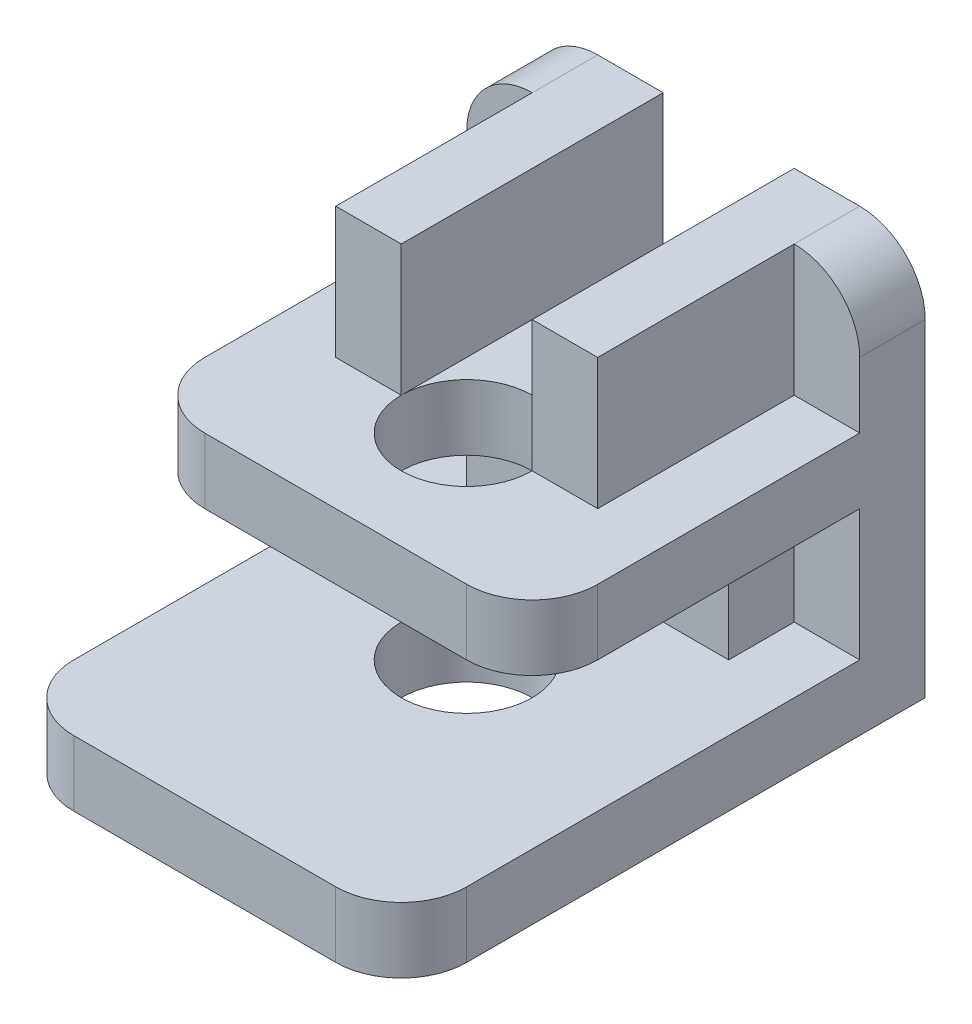
ISO-10303-21;
HEADER;
FILE_DESCRIPTION(('STEP AP214'),'2;1');
FILE_NAME('part.step','',(''),(''),'','','');
FILE_SCHEMA(('AUTOMOTIVE_DESIGN { 1 0 10303 214 1 1 1 1 }'));
ENDSEC;
DATA;
#1=APPLICATION_CONTEXT('core data for automotive mechanical design processes');
#2=APPLICATION_PROTOCOL_DEFINITION('international standard','automotive_design',2000,#1);
#3=PRODUCT_CONTEXT('',#1,'mechanical');
#4=PRODUCT('Part','Part','',(#3));
#5=PRODUCT_RELATED_PRODUCT_CATEGORY('part','',(#4));
#6=PRODUCT_DEFINITION_FORMATION('','',#4);
#7=PRODUCT_DEFINITION_CONTEXT('part definition',#1,'design');
#8=PRODUCT_DEFINITION('design','',#6,#7);
#9=PRODUCT_DEFINITION_SHAPE('','',#8);
#10=(LENGTH_UNIT() NAMED_UNIT(*) SI_UNIT(.MILLI.,.METRE.));
#11=(NAMED_UNIT(*) PLANE_ANGLE_UNIT() SI_UNIT($,.RADIAN.));
#12=(NAMED_UNIT(*) SI_UNIT($,.STERADIAN.) SOLID_ANGLE_UNIT());
#13=UNCERTAINTY_MEASURE_WITH_UNIT(LENGTH_MEASURE(1.E-05),#10,'distance_accuracy_value','');
#14=(GEOMETRIC_REPRESENTATION_CONTEXT(3) GLOBAL_UNCERTAINTY_ASSIGNED_CONTEXT((#13)) GLOBAL_UNIT_ASSIGNED_CONTEXT((#10,
#11,#12)) REPRESENTATION_CONTEXT('',''));
#15=CARTESIAN_POINT('',(0.,0.,0.));
#16=DIRECTION('',(0.,0.,1.));
#17=DIRECTION('',(1.,0.,0.));
#18=AXIS2_PLACEMENT_3D('',#15,#16,#17);
#19=CARTESIAN_POINT('',(0.,40.,-20.));
#20=DIRECTION('',(0.,-1.,0.));
#21=DIRECTION('',(0.,0.,-1.));
#22=AXIS2_PLACEMENT_3D('',#19,#20,#21);
#23=PLANE('',#22);
#24=CARTESIAN_POINT('',(30.,40.,-40.));
#25=DIRECTION('',(0.,-1.,0.));
#26=DIRECTION('',(0.,0.,-1.));
#27=AXIS2_PLACEMENT_3D('',#24,#25,#26);
#28=CIRCLE('',#27,10.);
#29=CARTESIAN_POINT('',(20.,40.,-40.));
#30=VERTEX_POINT('',#29);
#31=CARTESIAN_POINT('',(40.,40.,-40.));
#32=VERTEX_POINT('',#31);
#33=EDGE_CURVE('E217',#30,#32,#28,.F.);
#34=ORIENTED_EDGE('',*,*,#33,.F.);
#35=DIRECTION('',(1.,0.,0.));
#36=VECTOR('',#35,1.);
#37=CARTESIAN_POINT('',(10.,40.,-40.));
#38=LINE('',#37,#36);
#39=CARTESIAN_POINT('',(10.,40.,-40.));
#40=VERTEX_POINT('',#39);
#41=EDGE_CURVE('E228',#40,#30,#38,.T.);
#42=ORIENTED_EDGE('',*,*,#41,.F.);
#43=DIRECTION('',(0.,0.,-1.));
#44=VECTOR('',#43,1.);
#45=CARTESIAN_POINT('',(10.,40.,-40.));
#46=LINE('',#45,#44);
#47=CARTESIAN_POINT('',(10.,40.,-70.));
#48=VERTEX_POINT('',#47);
#49=EDGE_CURVE('E279',#40,#48,#46,.T.);
#50=ORIENTED_EDGE('',*,*,#49,.T.);
#51=DIRECTION('',(-1.,0.,0.));
#52=VECTOR('',#51,1.);
#53=CARTESIAN_POINT('',(0.,40.,-70.));
#54=LINE('',#53,#52);
#55=CARTESIAN_POINT('',(0.,40.,-70.));
#56=VERTEX_POINT('',#55);
#57=EDGE_CURVE('E315',#48,#56,#54,.T.);
#58=ORIENTED_EDGE('',*,*,#57,.T.);
#59=DIRECTION('',(0.,0.,-1.));
#60=VECTOR('',#59,1.);
#61=CARTESIAN_POINT('',(0.,40.,-20.));
#62=LINE('',#61,#60);
#63=CARTESIAN_POINT('',(0.,40.,-30.));
#64=VERTEX_POINT('',#63);
#65=EDGE_CURVE('E311',#64,#56,#62,.T.);
#66=ORIENTED_EDGE('',*,*,#65,.F.);
#67=CARTESIAN_POINT('',(10.,40.,-30.));
#68=DIRECTION('',(0.,-1.,0.));
#69=DIRECTION('',(0.,0.,-1.));
#70=AXIS2_PLACEMENT_3D('',#67,#68,#69);
#71=CIRCLE('',#70,10.);
#72=CARTESIAN_POINT('',(10.,40.,-20.));
#73=VERTEX_POINT('',#72);
#74=EDGE_CURVE('E48',#64,#73,#71,.F.);
#75=ORIENTED_EDGE('',*,*,#74,.T.);
#76=DIRECTION('',(-1.,0.,0.));
#77=VECTOR('',#76,1.);
#78=CARTESIAN_POINT('',(0.,40.,-20.));
#79=LINE('',#78,#77);
#80=CARTESIAN_POINT('',(50.,40.,-20.));
#81=VERTEX_POINT('',#80);
#82=EDGE_CURVE('E308',#81,#73,#79,.T.);
#83=ORIENTED_EDGE('',*,*,#82,.F.);
#84=CARTESIAN_POINT('',(50.,40.,-30.));
#85=DIRECTION('',(0.,-1.,0.));
#86=DIRECTION('',(0.,0.,-1.));
#87=AXIS2_PLACEMENT_3D('',#84,#85,#86);
#88=CIRCLE('',#87,10.);
#89=CARTESIAN_POINT('',(60.,40.,-30.));
#90=VERTEX_POINT('',#89);
#91=EDGE_CURVE('E56',#81,#90,#88,.F.);
#92=ORIENTED_EDGE('',*,*,#91,.T.);
#93=DIRECTION('',(0.,0.,-1.));
#94=VECTOR('',#93,1.);
#95=CARTESIAN_POINT('',(60.,40.,-20.));
#96=LINE('',#95,#94);
#97=CARTESIAN_POINT('',(60.,40.,-70.));
#98=VERTEX_POINT('',#97);
#99=EDGE_CURVE('E320',#90,#98,#96,.T.);
#100=ORIENTED_EDGE('',*,*,#99,.T.);
#101=CARTESIAN_POINT('',(50.,40.,-70.));
#102=VERTEX_POINT('',#101);
#103=EDGE_CURVE('E309',#98,#102,#54,.T.);
#104=ORIENTED_EDGE('',*,*,#103,.T.);
#105=DIRECTION('',(0.,0.,-1.));
#106=VECTOR('',#105,1.);
#107=CARTESIAN_POINT('',(50.,40.,-40.));
#108=LINE('',#107,#106);
#109=CARTESIAN_POINT('',(50.,40.,-40.));
#110=VERTEX_POINT('',#109);
#111=EDGE_CURVE('E277',#110,#102,#108,.T.);
#112=ORIENTED_EDGE('',*,*,#111,.F.);
#113=EDGE_CURVE('E230',#32,#110,#38,.T.);
#114=ORIENTED_EDGE('',*,*,#113,.F.);
#115=EDGE_LOOP('',(#34,#42,#50,#58,#66,#75,#83,#92,#100,#104,#112,#114));
#116=FACE_BOUND('',#115,.T.);
#117=ADVANCED_FACE('F33',(#116),#23,.F.);
#118=CARTESIAN_POINT('',(0.,60.,0.));
#119=DIRECTION('',(0.,1.,0.));
#120=DIRECTION('',(0.,0.,1.));
#121=AXIS2_PLACEMENT_3D('',#118,#119,#120);
#122=PLANE('',#121);
#123=DIRECTION('',(-1.,0.,0.));
#124=VECTOR('',#123,1.);
#125=CARTESIAN_POINT('',(0.,60.,-80.));
#126=LINE('',#125,#124);
#127=CARTESIAN_POINT('',(20.,60.,-80.));
#128=VERTEX_POINT('',#127);
#129=CARTESIAN_POINT('',(10.,60.,-80.));
#130=VERTEX_POINT('',#129);
#131=EDGE_CURVE('E330',#128,#130,#126,.T.);
#132=ORIENTED_EDGE('',*,*,#131,.T.);
#133=DIRECTION('',(0.,0.,1.));
#134=VECTOR('',#133,1.);
#135=CARTESIAN_POINT('',(10.,60.,-70.));
#136=LINE('',#135,#134);
#137=CARTESIAN_POINT('',(10.,60.,-70.));
#138=VERTEX_POINT('',#137);
#139=EDGE_CURVE('E390',#130,#138,#136,.T.);
#140=ORIENTED_EDGE('',*,*,#139,.T.);
#141=DIRECTION('',(0.,0.,-1.));
#142=VECTOR('',#141,1.);
#143=CARTESIAN_POINT('',(10.,60.,-40.));
#144=LINE('',#143,#142);
#145=CARTESIAN_POINT('',(10.,60.,-40.));
#146=VERTEX_POINT('',#145);
#147=EDGE_CURVE('E265',#146,#138,#144,.T.);
#148=ORIENTED_EDGE('',*,*,#147,.F.);
#149=DIRECTION('',(-1.,0.,0.));
#150=VECTOR('',#149,1.);
#151=CARTESIAN_POINT('',(10.,60.,-40.));
#152=LINE('',#151,#150);
#153=CARTESIAN_POINT('',(20.,60.,-40.));
#154=VERTEX_POINT('',#153);
#155=EDGE_CURVE('E257',#154,#146,#152,.T.);
#156=ORIENTED_EDGE('',*,*,#155,.F.);
#157=DIRECTION('',(0.,0.,1.));
#158=VECTOR('',#157,1.);
#159=CARTESIAN_POINT('',(20.,60.,-90.));
#160=LINE('',#159,#158);
#161=EDGE_CURVE('E240',#128,#154,#160,.T.);
#162=ORIENTED_EDGE('',*,*,#161,.F.);
#163=EDGE_LOOP('',(#132,#140,#148,#156,#162));
#164=FACE_BOUND('',#163,.T.);
#165=ADVANCED_FACE('F498',(#164),#122,.T.);
#166=CARTESIAN_POINT('',(0.,0.,-40.));
#167=DIRECTION('',(0.,0.,1.));
#168=DIRECTION('',(1.,0.,0.));
#169=AXIS2_PLACEMENT_3D('',#166,#167,#168);
#170=PLANE('',#169);
#171=DIRECTION('',(0.,-1.,0.));
#172=VECTOR('',#171,1.);
#173=CARTESIAN_POINT('',(20.,60.,-40.));
#174=LINE('',#173,#172);
#175=EDGE_CURVE('E235',#154,#30,#174,.T.);
#176=ORIENTED_EDGE('',*,*,#175,.F.);
#177=ORIENTED_EDGE('',*,*,#155,.T.);
#178=DIRECTION('',(0.,-1.,0.));
#179=VECTOR('',#178,1.);
#180=CARTESIAN_POINT('',(10.,60.,-40.));
#181=LINE('',#180,#179);
#182=EDGE_CURVE('E254',#146,#40,#181,.T.);
#183=ORIENTED_EDGE('',*,*,#182,.T.);
#184=ORIENTED_EDGE('',*,*,#41,.T.);
#185=EDGE_LOOP('',(#176,#177,#183,#184));
#186=FACE_BOUND('',#185,.T.);
#187=ADVANCED_FACE('F252',(#186),#170,.T.);
#188=CARTESIAN_POINT('',(0.,60.,-70.));
#189=DIRECTION('',(0.,0.,-1.));
#190=DIRECTION('',(-1.,0.,0.));
#191=AXIS2_PLACEMENT_3D('',#188,#189,#190);
#192=PLANE('',#191);
#193=DIRECTION('',(0.,-1.,0.));
#194=VECTOR('',#193,1.);
#195=CARTESIAN_POINT('',(10.,60.,-70.));
#196=LINE('',#195,#194);
#197=EDGE_CURVE('E266',#138,#48,#196,.T.);
#198=ORIENTED_EDGE('',*,*,#197,.F.);
#199=CARTESIAN_POINT('',(10.,50.,-70.));
#200=DIRECTION('',(0.,0.,-1.));
#201=DIRECTION('',(-1.,0.,0.));
#202=AXIS2_PLACEMENT_3D('',#199,#200,#201);
#203=CIRCLE('',#202,10.);
#204=CARTESIAN_POINT('',(0.,50.,-70.));
#205=VERTEX_POINT('',#204);
#206=EDGE_CURVE('E393',#138,#205,#203,.F.);
#207=ORIENTED_EDGE('',*,*,#206,.T.);
#208=DIRECTION('',(0.,-1.,0.));
#209=VECTOR('',#208,1.);
#210=CARTESIAN_POINT('',(0.,60.,-70.));
#211=LINE('',#210,#209);
#212=EDGE_CURVE('E338',#205,#56,#211,.T.);
#213=ORIENTED_EDGE('',*,*,#212,.T.);
#214=ORIENTED_EDGE('',*,*,#57,.F.);
#215=EDGE_LOOP('',(#198,#207,#213,#214));
#216=FACE_BOUND('',#215,.T.);
#217=ADVANCED_FACE('F507',(#216),#192,.F.);
#218=DIRECTION('',(0.,-1.,0.));
#219=VECTOR('',#218,1.);
#220=CARTESIAN_POINT('',(60.,60.,-70.));
#221=LINE('',#220,#219);
#222=CARTESIAN_POINT('',(60.,50.,-70.));
#223=VERTEX_POINT('',#222);
#224=EDGE_CURVE('E334',#223,#98,#221,.T.);
#225=ORIENTED_EDGE('',*,*,#224,.F.);
#226=CARTESIAN_POINT('',(50.,50.,-70.));
#227=DIRECTION('',(0.,0.,-1.));
#228=DIRECTION('',(-1.,0.,0.));
#229=AXIS2_PLACEMENT_3D('',#226,#227,#228);
#230=CIRCLE('',#229,10.);
#231=CARTESIAN_POINT('',(50.,60.,-70.));
#232=VERTEX_POINT('',#231);
#233=EDGE_CURVE('E402',#223,#232,#230,.F.);
#234=ORIENTED_EDGE('',*,*,#233,.T.);
#235=DIRECTION('',(0.,1.,0.));
#236=VECTOR('',#235,1.);
#237=CARTESIAN_POINT('',(50.,60.,-70.));
#238=LINE('',#237,#236);
#239=EDGE_CURVE('E268',#102,#232,#238,.T.);
#240=ORIENTED_EDGE('',*,*,#239,.F.);
#241=ORIENTED_EDGE('',*,*,#103,.F.);
#242=EDGE_LOOP('',(#225,#234,#240,#241));
#243=FACE_BOUND('',#242,.T.);
#244=ADVANCED_FACE('F471',(#243),#192,.F.);
#245=EDGE_CURVE('E213',#32,#30,#28,.F.);
#246=ORIENTED_EDGE('',*,*,#245,.F.);
#247=DIRECTION('',(0.,0.,1.));
#248=VECTOR('',#247,1.);
#249=CARTESIAN_POINT('',(40.,40.,-90.));
#250=LINE('',#249,#248);
#251=CARTESIAN_POINT('',(40.,40.,-80.));
#252=VERTEX_POINT('',#251);
#253=EDGE_CURVE('E249',#252,#32,#250,.T.);
#254=ORIENTED_EDGE('',*,*,#253,.F.);
#255=DIRECTION('',(1.,0.,0.));
#256=VECTOR('',#255,1.);
#257=CARTESIAN_POINT('',(0.,40.,-80.));
#258=LINE('',#257,#256);
#259=CARTESIAN_POINT('',(20.,40.,-80.));
#260=VERTEX_POINT('',#259);
#261=EDGE_CURVE('E248',#260,#252,#258,.T.);
#262=ORIENTED_EDGE('',*,*,#261,.F.);
#263=DIRECTION('',(0.,0.,1.));
#264=VECTOR('',#263,1.);
#265=CARTESIAN_POINT('',(20.,40.,-90.));
#266=LINE('',#265,#264);
#267=EDGE_CURVE('E237',#260,#30,#266,.T.);
#268=ORIENTED_EDGE('',*,*,#267,.T.);
#269=EDGE_LOOP('',(#246,#254,#262,#268));
#270=FACE_BOUND('',#269,.T.);
#271=ADVANCED_FACE('F246',(#270),#23,.F.);
#272=DIRECTION('',(0.,-1.,0.));
#273=VECTOR('',#272,1.);
#274=CARTESIAN_POINT('',(10.,30.,-70.));
#275=LINE('',#274,#273);
#276=CARTESIAN_POINT('',(10.,30.,-70.));
#277=VERTEX_POINT('',#276);
#278=CARTESIAN_POINT('',(10.,10.,-70.));
#279=VERTEX_POINT('',#278);
#280=EDGE_CURVE('E281',#277,#279,#275,.T.);
#281=ORIENTED_EDGE('',*,*,#280,.F.);
#282=DIRECTION('',(1.,0.,0.));
#283=VECTOR('',#282,1.);
#284=CARTESIAN_POINT('',(0.,30.,-70.));
#285=LINE('',#284,#283);
#286=CARTESIAN_POINT('',(0.,30.,-70.));
#287=VERTEX_POINT('',#286);
#288=EDGE_CURVE('E312',#287,#277,#285,.T.);
#289=ORIENTED_EDGE('',*,*,#288,.F.);
#290=CARTESIAN_POINT('',(0.,10.,-70.));
#291=VERTEX_POINT('',#290);
#292=EDGE_CURVE('E337',#287,#291,#211,.T.);
#293=ORIENTED_EDGE('',*,*,#292,.T.);
#294=DIRECTION('',(1.,0.,0.));
#295=VECTOR('',#294,1.);
#296=CARTESIAN_POINT('',(0.,10.,-70.));
#297=LINE('',#296,#295);
#298=EDGE_CURVE('E331',#291,#279,#297,.T.);
#299=ORIENTED_EDGE('',*,*,#298,.T.);
#300=EDGE_LOOP('',(#281,#289,#293,#299));
#301=FACE_BOUND('',#300,.T.);
#302=ADVANCED_FACE('F531',(#301),#192,.F.);
#303=DIRECTION('',(0.,1.,0.));
#304=VECTOR('',#303,1.);
#305=CARTESIAN_POINT('',(50.,30.,-70.));
#306=LINE('',#305,#304);
#307=CARTESIAN_POINT('',(50.,10.,-70.));
#308=VERTEX_POINT('',#307);
#309=CARTESIAN_POINT('',(50.,30.,-70.));
#310=VERTEX_POINT('',#309);
#311=EDGE_CURVE('E285',#308,#310,#306,.T.);
#312=ORIENTED_EDGE('',*,*,#311,.F.);
#313=CARTESIAN_POINT('',(60.,10.,-70.));
#314=VERTEX_POINT('',#313);
#315=EDGE_CURVE('E326',#308,#314,#297,.T.);
#316=ORIENTED_EDGE('',*,*,#315,.T.);
#317=CARTESIAN_POINT('',(60.,30.,-70.));
#318=VERTEX_POINT('',#317);
#319=EDGE_CURVE('E329',#318,#314,#221,.T.);
#320=ORIENTED_EDGE('',*,*,#319,.F.);
#321=EDGE_CURVE('E304',#310,#318,#285,.T.);
#322=ORIENTED_EDGE('',*,*,#321,.F.);
#323=EDGE_LOOP('',(#312,#316,#320,#322));
#324=FACE_BOUND('',#323,.T.);
#325=ADVANCED_FACE('F441',(#324),#192,.F.);
#326=CARTESIAN_POINT('',(0.,10.,0.));
#327=DIRECTION('',(0.,-1.,0.));
#328=DIRECTION('',(0.,0.,-1.));
#329=AXIS2_PLACEMENT_3D('',#326,#327,#328);
#330=PLANE('',#329);
#331=CARTESIAN_POINT('',(30.,10.,-40.));
#332=DIRECTION('',(0.,-1.,0.));
#333=DIRECTION('',(0.,0.,-1.));
#334=AXIS2_PLACEMENT_3D('',#331,#332,#333);
#335=CIRCLE('',#334,10.);
#336=CARTESIAN_POINT('',(30.,10.,-50.));
#337=VERTEX_POINT('',#336);
#338=EDGE_CURVE('E244',#337,#337,#335,.F.);
#339=ORIENTED_EDGE('',*,*,#338,.F.);
#340=EDGE_LOOP('',(#339));
#341=FACE_BOUND('',#340,.T.);
#342=DIRECTION('',(1.,0.,0.));
#343=VECTOR('',#342,1.);
#344=CARTESIAN_POINT('',(0.,10.,0.));
#345=LINE('',#344,#343);
#346=CARTESIAN_POINT('',(10.,10.,0.));
#347=VERTEX_POINT('',#346);
#348=CARTESIAN_POINT('',(50.,10.,0.));
#349=VERTEX_POINT('',#348);
#350=EDGE_CURVE('E344',#347,#349,#345,.T.);
#351=ORIENTED_EDGE('',*,*,#350,.T.);
#352=CARTESIAN_POINT('',(50.,10.,-10.));
#353=DIRECTION('',(0.,-1.,0.));
#354=DIRECTION('',(0.,0.,-1.));
#355=AXIS2_PLACEMENT_3D('',#352,#353,#354);
#356=CIRCLE('',#355,10.);
#357=CARTESIAN_POINT('',(60.,10.,-10.));
#358=VERTEX_POINT('',#357);
#359=EDGE_CURVE('E382',#349,#358,#356,.F.);
#360=ORIENTED_EDGE('',*,*,#359,.T.);
#361=DIRECTION('',(0.,0.,-1.));
#362=VECTOR('',#361,1.);
#363=CARTESIAN_POINT('',(60.,10.,0.));
#364=LINE('',#363,#362);
#365=EDGE_CURVE('E348',#358,#314,#364,.T.);
#366=ORIENTED_EDGE('',*,*,#365,.T.);
#367=ORIENTED_EDGE('',*,*,#315,.F.);
#368=DIRECTION('',(0.,0.,-1.));
#369=VECTOR('',#368,1.);
#370=CARTESIAN_POINT('',(50.,10.,-60.));
#371=LINE('',#370,#369);
#372=CARTESIAN_POINT('',(50.,10.,-60.));
#373=VERTEX_POINT('',#372);
#374=EDGE_CURVE('E299',#373,#308,#371,.T.);
#375=ORIENTED_EDGE('',*,*,#374,.F.);
#376=DIRECTION('',(1.,0.,0.));
#377=VECTOR('',#376,1.);
#378=CARTESIAN_POINT('',(10.,10.,-60.));
#379=LINE('',#378,#377);
#380=CARTESIAN_POINT('',(10.,10.,-60.));
#381=VERTEX_POINT('',#380);
#382=EDGE_CURVE('E284',#381,#373,#379,.T.);
#383=ORIENTED_EDGE('',*,*,#382,.F.);
#384=DIRECTION('',(0.,0.,-1.));
#385=VECTOR('',#384,1.);
#386=CARTESIAN_POINT('',(10.,10.,-60.));
#387=LINE('',#386,#385);
#388=EDGE_CURVE('E301',#381,#279,#387,.T.);
#389=ORIENTED_EDGE('',*,*,#388,.T.);
#390=ORIENTED_EDGE('',*,*,#298,.F.);
#391=DIRECTION('',(0.,0.,1.));
#392=VECTOR('',#391,1.);
#393=CARTESIAN_POINT('',(0.,10.,0.));
#394=LINE('',#393,#392);
#395=CARTESIAN_POINT('',(0.,10.,-10.));
#396=VERTEX_POINT('',#395);
#397=EDGE_CURVE('E341',#291,#396,#394,.T.);
#398=ORIENTED_EDGE('',*,*,#397,.T.);
#399=CARTESIAN_POINT('',(10.,10.,-10.));
#400=DIRECTION('',(0.,-1.,0.));
#401=DIRECTION('',(0.,0.,-1.));
#402=AXIS2_PLACEMENT_3D('',#399,#400,#401);
#403=CIRCLE('',#402,10.);
#404=EDGE_CURVE('E380',#396,#347,#403,.F.);
#405=ORIENTED_EDGE('',*,*,#404,.T.);
#406=EDGE_LOOP('',(#351,#360,#366,#367,#375,#383,#389,#390,#398,#405));
#407=FACE_BOUND('',#406,.T.);
#408=ADVANCED_FACE('F445',(#341,#407),#330,.F.);
#409=CARTESIAN_POINT('',(0.,30.,-20.));
#410=DIRECTION('',(0.,1.,0.));
#411=DIRECTION('',(0.,0.,1.));
#412=AXIS2_PLACEMENT_3D('',#409,#410,#411);
#413=PLANE('',#412);
#414=CARTESIAN_POINT('',(30.,30.,-40.));
#415=DIRECTION('',(0.,1.,0.));
#416=DIRECTION('',(0.,0.,1.));
#417=AXIS2_PLACEMENT_3D('',#414,#415,#416);
#418=CIRCLE('',#417,10.);
#419=CARTESIAN_POINT('',(30.,30.,-30.));
#420=VERTEX_POINT('',#419);
#421=EDGE_CURVE('E813',#420,#420,#418,.F.);
#422=ORIENTED_EDGE('',*,*,#421,.F.);
#423=EDGE_LOOP('',(#422));
#424=FACE_BOUND('',#423,.T.);
#425=DIRECTION('',(0.,0.,-1.));
#426=VECTOR('',#425,1.);
#427=CARTESIAN_POINT('',(60.,30.,-20.));
#428=LINE('',#427,#426);
#429=CARTESIAN_POINT('',(60.,30.,-30.));
#430=VERTEX_POINT('',#429);
#431=EDGE_CURVE('E322',#430,#318,#428,.T.);
#432=ORIENTED_EDGE('',*,*,#431,.F.);
#433=CARTESIAN_POINT('',(50.,30.,-30.));
#434=DIRECTION('',(0.,1.,0.));
#435=DIRECTION('',(0.,0.,1.));
#436=AXIS2_PLACEMENT_3D('',#433,#434,#435);
#437=CIRCLE('',#436,10.);
#438=CARTESIAN_POINT('',(50.,30.,-20.));
#439=VERTEX_POINT('',#438);
#440=EDGE_CURVE('E11',#430,#439,#437,.F.);
#441=ORIENTED_EDGE('',*,*,#440,.T.);
#442=DIRECTION('',(1.,0.,0.));
#443=VECTOR('',#442,1.);
#444=CARTESIAN_POINT('',(0.,30.,-20.));
#445=LINE('',#444,#443);
#446=CARTESIAN_POINT('',(10.,30.,-20.));
#447=VERTEX_POINT('',#446);
#448=EDGE_CURVE('E305',#447,#439,#445,.T.);
#449=ORIENTED_EDGE('',*,*,#448,.F.);
#450=CARTESIAN_POINT('',(10.,30.,-30.));
#451=DIRECTION('',(0.,1.,0.));
#452=DIRECTION('',(0.,0.,1.));
#453=AXIS2_PLACEMENT_3D('',#450,#451,#452);
#454=CIRCLE('',#453,10.);
#455=CARTESIAN_POINT('',(0.,30.,-30.));
#456=VERTEX_POINT('',#455);
#457=EDGE_CURVE('E41',#447,#456,#454,.F.);
#458=ORIENTED_EDGE('',*,*,#457,.T.);
#459=DIRECTION('',(0.,0.,-1.));
#460=VECTOR('',#459,1.);
#461=CARTESIAN_POINT('',(0.,30.,-20.));
#462=LINE('',#461,#460);
#463=EDGE_CURVE('E324',#456,#287,#462,.T.);
#464=ORIENTED_EDGE('',*,*,#463,.T.);
#465=ORIENTED_EDGE('',*,*,#288,.T.);
#466=DIRECTION('',(0.,0.,-1.));
#467=VECTOR('',#466,1.);
#468=CARTESIAN_POINT('',(10.,30.,-60.));
#469=LINE('',#468,#467);
#470=CARTESIAN_POINT('',(10.,30.,-60.));
#471=VERTEX_POINT('',#470);
#472=EDGE_CURVE('E292',#471,#277,#469,.T.);
#473=ORIENTED_EDGE('',*,*,#472,.F.);
#474=DIRECTION('',(-1.,0.,0.));
#475=VECTOR('',#474,1.);
#476=CARTESIAN_POINT('',(10.,30.,-60.));
#477=LINE('',#476,#475);
#478=CARTESIAN_POINT('',(50.,30.,-60.));
#479=VERTEX_POINT('',#478);
#480=EDGE_CURVE('E290',#479,#471,#477,.T.);
#481=ORIENTED_EDGE('',*,*,#480,.F.);
#482=DIRECTION('',(0.,0.,-1.));
#483=VECTOR('',#482,1.);
#484=CARTESIAN_POINT('',(50.,30.,-60.));
#485=LINE('',#484,#483);
#486=EDGE_CURVE('E296',#479,#310,#485,.T.);
#487=ORIENTED_EDGE('',*,*,#486,.T.);
#488=ORIENTED_EDGE('',*,*,#321,.T.);
#489=EDGE_LOOP('',(#432,#441,#449,#458,#464,#465,#473,#481,#487,#488));
#490=FACE_BOUND('',#489,.T.);
#491=ADVANCED_FACE('F414',(#424,#490),#413,.F.);
#492=CARTESIAN_POINT('',(0.,10.,0.));
#493=DIRECTION('',(1.,0.,0.));
#494=DIRECTION('',(0.,0.,-1.));
#495=AXIS2_PLACEMENT_3D('',#492,#493,#494);
#496=PLANE('',#495);
#497=DIRECTION('',(0.,0.,1.));
#498=VECTOR('',#497,1.);
#499=CARTESIAN_POINT('',(0.,0.,0.));
#500=LINE('',#499,#498);
#501=CARTESIAN_POINT('',(0.,0.,-80.));
#502=VERTEX_POINT('',#501);
#503=CARTESIAN_POINT('',(0.,0.,-10.));
#504=VERTEX_POINT('',#503);
#505=EDGE_CURVE('E340',#502,#504,#500,.T.);
#506=ORIENTED_EDGE('',*,*,#505,.T.);
#507=DIRECTION('',(0.,-1.,0.));
#508=VECTOR('',#507,1.);
#509=CARTESIAN_POINT('',(0.,10.,-10.));
#510=LINE('',#509,#508);
#511=EDGE_CURVE('E388',#504,#396,#510,.F.);
#512=ORIENTED_EDGE('',*,*,#511,.T.);
#513=ORIENTED_EDGE('',*,*,#397,.F.);
#514=ORIENTED_EDGE('',*,*,#292,.F.);
#515=ORIENTED_EDGE('',*,*,#463,.F.);
#516=DIRECTION('',(0.,-1.,0.));
#517=VECTOR('',#516,1.);
#518=CARTESIAN_POINT('',(0.,40.,-30.));
#519=LINE('',#518,#517);
#520=EDGE_CURVE('E384',#456,#64,#519,.F.);
#521=ORIENTED_EDGE('',*,*,#520,.T.);
#522=ORIENTED_EDGE('',*,*,#65,.T.);
#523=ORIENTED_EDGE('',*,*,#212,.F.);
#524=DIRECTION('',(0.,0.,1.));
#525=VECTOR('',#524,1.);
#526=CARTESIAN_POINT('',(0.,50.,-80.));
#527=LINE('',#526,#525);
#528=CARTESIAN_POINT('',(0.,50.,-80.));
#529=VERTEX_POINT('',#528);
#530=EDGE_CURVE('E386',#205,#529,#527,.F.);
#531=ORIENTED_EDGE('',*,*,#530,.T.);
#532=DIRECTION('',(0.,-1.,0.));
#533=VECTOR('',#532,1.);
#534=CARTESIAN_POINT('',(0.,10.,-80.));
#535=LINE('',#534,#533);
#536=EDGE_CURVE('E350',#529,#502,#535,.T.);
#537=ORIENTED_EDGE('',*,*,#536,.T.);
#538=EDGE_LOOP('',(#506,#512,#513,#514,#515,#521,#522,#523,#531,#537));
#539=FACE_BOUND('',#538,.T.);
#540=ADVANCED_FACE('F421',(#539),#496,.F.);
#541=CARTESIAN_POINT('',(0.,10.,0.));
#542=DIRECTION('',(0.,0.,-1.));
#543=DIRECTION('',(-1.,0.,0.));
#544=AXIS2_PLACEMENT_3D('',#541,#542,#543);
#545=PLANE('',#544);
#546=DIRECTION('',(1.,0.,0.));
#547=VECTOR('',#546,1.);
#548=CARTESIAN_POINT('',(0.,0.,0.));
#549=LINE('',#548,#547);
#550=CARTESIAN_POINT('',(10.,0.,0.));
#551=VERTEX_POINT('',#550);
#552=CARTESIAN_POINT('',(50.,0.,0.));
#553=VERTEX_POINT('',#552);
#554=EDGE_CURVE('E353',#551,#553,#549,.T.);
#555=ORIENTED_EDGE('',*,*,#554,.T.);
#556=DIRECTION('',(0.,-1.,0.));
#557=VECTOR('',#556,1.);
#558=CARTESIAN_POINT('',(50.,10.,0.));
#559=LINE('',#558,#557);
#560=EDGE_CURVE('E378',#553,#349,#559,.F.);
#561=ORIENTED_EDGE('',*,*,#560,.T.);
#562=ORIENTED_EDGE('',*,*,#350,.F.);
#563=DIRECTION('',(0.,-1.,0.));
#564=VECTOR('',#563,1.);
#565=CARTESIAN_POINT('',(10.,10.,0.));
#566=LINE('',#565,#564);
#567=EDGE_CURVE('E375',#347,#551,#566,.T.);
#568=ORIENTED_EDGE('',*,*,#567,.T.);
#569=EDGE_LOOP('',(#555,#561,#562,#568));
#570=FACE_BOUND('',#569,.T.);
#571=ADVANCED_FACE('F560',(#570),#545,.F.);
#572=CARTESIAN_POINT('',(60.,10.,0.));
#573=DIRECTION('',(-1.,0.,0.));
#574=DIRECTION('',(0.,0.,1.));
#575=AXIS2_PLACEMENT_3D('',#572,#573,#574);
#576=PLANE('',#575);
#577=ORIENTED_EDGE('',*,*,#365,.F.);
#578=DIRECTION('',(0.,-1.,0.));
#579=VECTOR('',#578,1.);
#580=CARTESIAN_POINT('',(60.,10.,-10.));
#581=LINE('',#580,#579);
#582=CARTESIAN_POINT('',(60.,0.,-10.));
#583=VERTEX_POINT('',#582);
#584=EDGE_CURVE('E368',#358,#583,#581,.T.);
#585=ORIENTED_EDGE('',*,*,#584,.T.);
#586=DIRECTION('',(0.,0.,-1.));
#587=VECTOR('',#586,1.);
#588=CARTESIAN_POINT('',(60.,0.,0.));
#589=LINE('',#588,#587);
#590=CARTESIAN_POINT('',(60.,0.,-80.));
#591=VERTEX_POINT('',#590);
#592=EDGE_CURVE('E356',#583,#591,#589,.T.);
#593=ORIENTED_EDGE('',*,*,#592,.T.);
#594=DIRECTION('',(0.,-1.,0.));
#595=VECTOR('',#594,1.);
#596=CARTESIAN_POINT('',(60.,10.,-80.));
#597=LINE('',#596,#595);
#598=CARTESIAN_POINT('',(60.,50.,-80.));
#599=VERTEX_POINT('',#598);
#600=EDGE_CURVE('E362',#599,#591,#597,.T.);
#601=ORIENTED_EDGE('',*,*,#600,.F.);
#602=DIRECTION('',(0.,0.,-1.));
#603=VECTOR('',#602,1.);
#604=CARTESIAN_POINT('',(60.,50.,-70.));
#605=LINE('',#604,#603);
#606=EDGE_CURVE('E366',#599,#223,#605,.F.);
#607=ORIENTED_EDGE('',*,*,#606,.T.);
#608=ORIENTED_EDGE('',*,*,#224,.T.);
#609=ORIENTED_EDGE('',*,*,#99,.F.);
#610=DIRECTION('',(0.,1.,0.));
#611=VECTOR('',#610,1.);
#612=CARTESIAN_POINT('',(60.,30.,-30.));
#613=LINE('',#612,#611);
#614=EDGE_CURVE('E364',#90,#430,#613,.F.);
#615=ORIENTED_EDGE('',*,*,#614,.T.);
#616=ORIENTED_EDGE('',*,*,#431,.T.);
#617=ORIENTED_EDGE('',*,*,#319,.T.);
#618=EDGE_LOOP('',(#577,#585,#593,#601,#607,#608,#609,#615,#616,#617));
#619=FACE_BOUND('',#618,.T.);
#620=ADVANCED_FACE('F428',(#619),#576,.F.);
#621=CARTESIAN_POINT('',(0.,10.,-80.));
#622=DIRECTION('',(0.,0.,1.));
#623=DIRECTION('',(1.,0.,0.));
#624=AXIS2_PLACEMENT_3D('',#621,#622,#623);
#625=PLANE('',#624);
#626=ORIENTED_EDGE('',*,*,#536,.F.);
#627=CARTESIAN_POINT('',(10.,50.,-80.));
#628=DIRECTION('',(0.,0.,1.));
#629=DIRECTION('',(1.,0.,0.));
#630=AXIS2_PLACEMENT_3D('',#627,#628,#629);
#631=CIRCLE('',#630,10.);
#632=EDGE_CURVE('E397',#529,#130,#631,.F.);
#633=ORIENTED_EDGE('',*,*,#632,.T.);
#634=ORIENTED_EDGE('',*,*,#131,.F.);
#635=DIRECTION('',(0.,-1.,0.));
#636=VECTOR('',#635,1.);
#637=CARTESIAN_POINT('',(20.,10.,-80.));
#638=LINE('',#637,#636);
#639=EDGE_CURVE('E269',#128,#260,#638,.T.);
#640=ORIENTED_EDGE('',*,*,#639,.T.);
#641=ORIENTED_EDGE('',*,*,#261,.T.);
#642=DIRECTION('',(0.,1.,0.));
#643=VECTOR('',#642,1.);
#644=CARTESIAN_POINT('',(40.,10.,-80.));
#645=LINE('',#644,#643);
#646=CARTESIAN_POINT('',(40.,60.,-80.));
#647=VERTEX_POINT('',#646);
#648=EDGE_CURVE('E493',#252,#647,#645,.T.);
#649=ORIENTED_EDGE('',*,*,#648,.T.);
#650=CARTESIAN_POINT('',(50.,60.,-80.));
#651=VERTEX_POINT('',#650);
#652=EDGE_CURVE('E327',#651,#647,#126,.T.);
#653=ORIENTED_EDGE('',*,*,#652,.F.);
#654=CARTESIAN_POINT('',(50.,50.,-80.));
#655=DIRECTION('',(0.,0.,1.));
#656=DIRECTION('',(1.,0.,0.));
#657=AXIS2_PLACEMENT_3D('',#654,#655,#656);
#658=CIRCLE('',#657,10.);
#659=EDGE_CURVE('E395',#651,#599,#658,.F.);
#660=ORIENTED_EDGE('',*,*,#659,.T.);
#661=ORIENTED_EDGE('',*,*,#600,.T.);
#662=DIRECTION('',(-1.,0.,0.));
#663=VECTOR('',#662,1.);
#664=CARTESIAN_POINT('',(0.,0.,-80.));
#665=LINE('',#664,#663);
#666=EDGE_CURVE('E345',#591,#502,#665,.T.);
#667=ORIENTED_EDGE('',*,*,#666,.T.);
#668=EDGE_LOOP('',(#626,#633,#634,#640,#641,#649,#653,#660,#661,#667));
#669=FACE_BOUND('',#668,.T.);
#670=ADVANCED_FACE('F461',(#669),#625,.F.);
#671=CARTESIAN_POINT('',(0.,0.,0.));
#672=DIRECTION('',(0.,-1.,0.));
#673=DIRECTION('',(0.,0.,-1.));
#674=AXIS2_PLACEMENT_3D('',#671,#672,#673);
#675=PLANE('',#674);
#676=CARTESIAN_POINT('',(30.,0.,-40.));
#677=DIRECTION('',(0.,-1.,0.));
#678=DIRECTION('',(0.,0.,-1.));
#679=AXIS2_PLACEMENT_3D('',#676,#677,#678);
#680=CIRCLE('',#679,10.);
#681=CARTESIAN_POINT('',(30.,0.,-50.));
#682=VERTEX_POINT('',#681);
#683=EDGE_CURVE('E231',#682,#682,#680,.F.);
#684=ORIENTED_EDGE('',*,*,#683,.T.);
#685=EDGE_LOOP('',(#684));
#686=FACE_BOUND('',#685,.T.);
#687=ORIENTED_EDGE('',*,*,#592,.F.);
#688=CARTESIAN_POINT('',(50.,0.,-10.));
#689=DIRECTION('',(0.,-1.,0.));
#690=DIRECTION('',(0.,0.,-1.));
#691=AXIS2_PLACEMENT_3D('',#688,#689,#690);
#692=CIRCLE('',#691,10.);
#693=EDGE_CURVE('E373',#583,#553,#692,.T.);
#694=ORIENTED_EDGE('',*,*,#693,.T.);
#695=ORIENTED_EDGE('',*,*,#554,.F.);
#696=CARTESIAN_POINT('',(10.,0.,-10.));
#697=DIRECTION('',(0.,-1.,0.));
#698=DIRECTION('',(0.,0.,-1.));
#699=AXIS2_PLACEMENT_3D('',#696,#697,#698);
#700=CIRCLE('',#699,10.);
#701=EDGE_CURVE('E371',#551,#504,#700,.T.);
#702=ORIENTED_EDGE('',*,*,#701,.T.);
#703=ORIENTED_EDGE('',*,*,#505,.F.);
#704=ORIENTED_EDGE('',*,*,#666,.F.);
#705=EDGE_LOOP('',(#687,#694,#695,#702,#703,#704));
#706=FACE_BOUND('',#705,.T.);
#707=ADVANCED_FACE('F456',(#686,#706),#675,.T.);
#708=DIRECTION('',(0.,0.,-1.));
#709=VECTOR('',#708,1.);
#710=CARTESIAN_POINT('',(50.,60.,-40.));
#711=LINE('',#710,#709);
#712=CARTESIAN_POINT('',(50.,60.,-40.));
#713=VERTEX_POINT('',#712);
#714=EDGE_CURVE('E274',#713,#232,#711,.T.);
#715=ORIENTED_EDGE('',*,*,#714,.T.);
#716=DIRECTION('',(0.,0.,-1.));
#717=VECTOR('',#716,1.);
#718=CARTESIAN_POINT('',(50.,60.,-80.));
#719=LINE('',#718,#717);
#720=EDGE_CURVE('E399',#232,#651,#719,.T.);
#721=ORIENTED_EDGE('',*,*,#720,.T.);
#722=ORIENTED_EDGE('',*,*,#652,.T.);
#723=DIRECTION('',(0.,0.,1.));
#724=VECTOR('',#723,1.);
#725=CARTESIAN_POINT('',(40.,60.,-90.));
#726=LINE('',#725,#724);
#727=CARTESIAN_POINT('',(40.,60.,-40.));
#728=VERTEX_POINT('',#727);
#729=EDGE_CURVE('E481',#647,#728,#726,.T.);
#730=ORIENTED_EDGE('',*,*,#729,.T.);
#731=EDGE_CURVE('E262',#713,#728,#152,.T.);
#732=ORIENTED_EDGE('',*,*,#731,.F.);
#733=EDGE_LOOP('',(#715,#721,#722,#730,#732));
#734=FACE_BOUND('',#733,.T.);
#735=ADVANCED_FACE('F478',(#734),#122,.T.);
#736=CARTESIAN_POINT('',(0.,0.,-20.));
#737=DIRECTION('',(0.,0.,1.));
#738=DIRECTION('',(1.,0.,0.));
#739=AXIS2_PLACEMENT_3D('',#736,#737,#738);
#740=PLANE('',#739);
#741=ORIENTED_EDGE('',*,*,#448,.T.);
#742=DIRECTION('',(0.,1.,0.));
#743=VECTOR('',#742,1.);
#744=CARTESIAN_POINT('',(50.,40.,-20.));
#745=LINE('',#744,#743);
#746=EDGE_CURVE('E407',#439,#81,#745,.T.);
#747=ORIENTED_EDGE('',*,*,#746,.T.);
#748=ORIENTED_EDGE('',*,*,#82,.T.);
#749=DIRECTION('',(0.,-1.,0.));
#750=VECTOR('',#749,1.);
#751=CARTESIAN_POINT('',(10.,30.,-20.));
#752=LINE('',#751,#750);
#753=EDGE_CURVE('E404',#73,#447,#752,.T.);
#754=ORIENTED_EDGE('',*,*,#753,.T.);
#755=EDGE_LOOP('',(#741,#747,#748,#754));
#756=FACE_BOUND('',#755,.T.);
#757=ADVANCED_FACE('F424',(#756),#740,.T.);
#758=CARTESIAN_POINT('',(10.,30.,-60.));
#759=DIRECTION('',(1.,0.,0.));
#760=DIRECTION('',(0.,1.,0.));
#761=AXIS2_PLACEMENT_3D('',#758,#759,#760);
#762=PLANE('',#761);
#763=ORIENTED_EDGE('',*,*,#280,.T.);
#764=ORIENTED_EDGE('',*,*,#388,.F.);
#765=DIRECTION('',(0.,-1.,0.));
#766=VECTOR('',#765,1.);
#767=CARTESIAN_POINT('',(10.,30.,-60.));
#768=LINE('',#767,#766);
#769=EDGE_CURVE('E282',#471,#381,#768,.T.);
#770=ORIENTED_EDGE('',*,*,#769,.F.);
#771=ORIENTED_EDGE('',*,*,#472,.T.);
#772=EDGE_LOOP('',(#763,#764,#770,#771));
#773=FACE_BOUND('',#772,.T.);
#774=ADVANCED_FACE('F592',(#773),#762,.F.);
#775=CARTESIAN_POINT('',(50.,30.,-60.));
#776=DIRECTION('',(-1.,0.,0.));
#777=DIRECTION('',(0.,0.,1.));
#778=AXIS2_PLACEMENT_3D('',#775,#776,#777);
#779=PLANE('',#778);
#780=ORIENTED_EDGE('',*,*,#311,.T.);
#781=ORIENTED_EDGE('',*,*,#486,.F.);
#782=DIRECTION('',(0.,1.,0.));
#783=VECTOR('',#782,1.);
#784=CARTESIAN_POINT('',(50.,30.,-60.));
#785=LINE('',#784,#783);
#786=EDGE_CURVE('E287',#373,#479,#785,.T.);
#787=ORIENTED_EDGE('',*,*,#786,.F.);
#788=ORIENTED_EDGE('',*,*,#374,.T.);
#789=EDGE_LOOP('',(#780,#781,#787,#788));
#790=FACE_BOUND('',#789,.T.);
#791=ADVANCED_FACE('F588',(#790),#779,.F.);
#792=CARTESIAN_POINT('',(0.,0.,-60.));
#793=DIRECTION('',(0.,0.,1.));
#794=DIRECTION('',(1.,0.,0.));
#795=AXIS2_PLACEMENT_3D('',#792,#793,#794);
#796=PLANE('',#795);
#797=ORIENTED_EDGE('',*,*,#769,.T.);
#798=ORIENTED_EDGE('',*,*,#382,.T.);
#799=ORIENTED_EDGE('',*,*,#786,.T.);
#800=ORIENTED_EDGE('',*,*,#480,.T.);
#801=EDGE_LOOP('',(#797,#798,#799,#800));
#802=FACE_BOUND('',#801,.T.);
#803=ADVANCED_FACE('F585',(#802),#796,.T.);
#804=CARTESIAN_POINT('',(10.,60.,-40.));
#805=DIRECTION('',(1.,0.,0.));
#806=DIRECTION('',(0.,1.,0.));
#807=AXIS2_PLACEMENT_3D('',#804,#805,#806);
#808=PLANE('',#807);
#809=ORIENTED_EDGE('',*,*,#197,.T.);
#810=ORIENTED_EDGE('',*,*,#49,.F.);
#811=ORIENTED_EDGE('',*,*,#182,.F.);
#812=ORIENTED_EDGE('',*,*,#147,.T.);
#813=EDGE_LOOP('',(#809,#810,#811,#812));
#814=FACE_BOUND('',#813,.T.);
#815=ADVANCED_FACE('F503',(#814),#808,.F.);
#816=CARTESIAN_POINT('',(50.,60.,-40.));
#817=DIRECTION('',(-1.,0.,0.));
#818=DIRECTION('',(0.,0.,1.));
#819=AXIS2_PLACEMENT_3D('',#816,#817,#818);
#820=PLANE('',#819);
#821=ORIENTED_EDGE('',*,*,#239,.T.);
#822=ORIENTED_EDGE('',*,*,#714,.F.);
#823=DIRECTION('',(0.,1.,0.));
#824=VECTOR('',#823,1.);
#825=CARTESIAN_POINT('',(50.,60.,-40.));
#826=LINE('',#825,#824);
#827=EDGE_CURVE('E255',#110,#713,#826,.T.);
#828=ORIENTED_EDGE('',*,*,#827,.F.);
#829=ORIENTED_EDGE('',*,*,#111,.T.);
#830=EDGE_LOOP('',(#821,#822,#828,#829));
#831=FACE_BOUND('',#830,.T.);
#832=ADVANCED_FACE('F474',(#831),#820,.F.);
#833=DIRECTION('',(0.,1.,0.));
#834=VECTOR('',#833,1.);
#835=CARTESIAN_POINT('',(40.,60.,-40.));
#836=LINE('',#835,#834);
#837=EDGE_CURVE('E243',#32,#728,#836,.T.);
#838=ORIENTED_EDGE('',*,*,#837,.F.);
#839=ORIENTED_EDGE('',*,*,#113,.T.);
#840=ORIENTED_EDGE('',*,*,#827,.T.);
#841=ORIENTED_EDGE('',*,*,#731,.T.);
#842=EDGE_LOOP('',(#838,#839,#840,#841));
#843=FACE_BOUND('',#842,.T.);
#844=ADVANCED_FACE('F484',(#843),#170,.T.);
#845=CARTESIAN_POINT('',(20.,60.,-90.));
#846=DIRECTION('',(-1.,0.,0.));
#847=DIRECTION('',(0.,-1.,0.));
#848=AXIS2_PLACEMENT_3D('',#845,#846,#847);
#849=PLANE('',#848);
#850=ORIENTED_EDGE('',*,*,#161,.T.);
#851=ORIENTED_EDGE('',*,*,#175,.T.);
#852=ORIENTED_EDGE('',*,*,#267,.F.);
#853=ORIENTED_EDGE('',*,*,#639,.F.);
#854=EDGE_LOOP('',(#850,#851,#852,#853));
#855=FACE_BOUND('',#854,.T.);
#856=ADVANCED_FACE('F236',(#855),#849,.F.);
#857=CARTESIAN_POINT('',(40.,60.,-90.));
#858=DIRECTION('',(1.,0.,0.));
#859=DIRECTION('',(0.,0.,-1.));
#860=AXIS2_PLACEMENT_3D('',#857,#858,#859);
#861=PLANE('',#860);
#862=ORIENTED_EDGE('',*,*,#253,.T.);
#863=ORIENTED_EDGE('',*,*,#837,.T.);
#864=ORIENTED_EDGE('',*,*,#729,.F.);
#865=ORIENTED_EDGE('',*,*,#648,.F.);
#866=EDGE_LOOP('',(#862,#863,#864,#865));
#867=FACE_BOUND('',#866,.T.);
#868=ADVANCED_FACE('F567',(#867),#861,.F.);
#869=CARTESIAN_POINT('',(50.,10.,-10.));
#870=DIRECTION('',(0.,-1.,0.));
#871=DIRECTION('',(0.,0.,-1.));
#872=AXIS2_PLACEMENT_3D('',#869,#870,#871);
#873=CYLINDRICAL_SURFACE('',#872,10.);
#874=ORIENTED_EDGE('',*,*,#359,.F.);
#875=ORIENTED_EDGE('',*,*,#560,.F.);
#876=ORIENTED_EDGE('',*,*,#693,.F.);
#877=ORIENTED_EDGE('',*,*,#584,.F.);
#878=EDGE_LOOP('',(#874,#875,#876,#877));
#879=FACE_BOUND('',#878,.T.);
#880=ADVANCED_FACE('F451',(#879),#873,.T.);
#881=CARTESIAN_POINT('',(10.,10.,-10.));
#882=DIRECTION('',(0.,-1.,0.));
#883=DIRECTION('',(0.,0.,-1.));
#884=AXIS2_PLACEMENT_3D('',#881,#882,#883);
#885=CYLINDRICAL_SURFACE('',#884,10.);
#886=ORIENTED_EDGE('',*,*,#404,.F.);
#887=ORIENTED_EDGE('',*,*,#511,.F.);
#888=ORIENTED_EDGE('',*,*,#701,.F.);
#889=ORIENTED_EDGE('',*,*,#567,.F.);
#890=EDGE_LOOP('',(#886,#887,#888,#889));
#891=FACE_BOUND('',#890,.T.);
#892=ADVANCED_FACE('F513',(#891),#885,.T.);
#893=CARTESIAN_POINT('',(10.,50.,0.));
#894=DIRECTION('',(0.,0.,-1.));
#895=DIRECTION('',(-1.,0.,0.));
#896=AXIS2_PLACEMENT_3D('',#893,#894,#895);
#897=CYLINDRICAL_SURFACE('',#896,10.);
#898=ORIENTED_EDGE('',*,*,#632,.F.);
#899=ORIENTED_EDGE('',*,*,#530,.F.);
#900=ORIENTED_EDGE('',*,*,#206,.F.);
#901=ORIENTED_EDGE('',*,*,#139,.F.);
#902=EDGE_LOOP('',(#898,#899,#900,#901));
#903=FACE_BOUND('',#902,.T.);
#904=ADVANCED_FACE('F511',(#903),#897,.T.);
#905=CARTESIAN_POINT('',(50.,50.,0.));
#906=DIRECTION('',(0.,0.,1.));
#907=DIRECTION('',(1.,0.,0.));
#908=AXIS2_PLACEMENT_3D('',#905,#906,#907);
#909=CYLINDRICAL_SURFACE('',#908,10.);
#910=ORIENTED_EDGE('',*,*,#233,.F.);
#911=ORIENTED_EDGE('',*,*,#606,.F.);
#912=ORIENTED_EDGE('',*,*,#659,.F.);
#913=ORIENTED_EDGE('',*,*,#720,.F.);
#914=EDGE_LOOP('',(#910,#911,#912,#913));
#915=FACE_BOUND('',#914,.T.);
#916=ADVANCED_FACE('F467',(#915),#909,.T.);
#917=CARTESIAN_POINT('',(50.,0.,-30.));
#918=DIRECTION('',(0.,-1.,0.));
#919=DIRECTION('',(0.,0.,-1.));
#920=AXIS2_PLACEMENT_3D('',#917,#918,#919);
#921=CYLINDRICAL_SURFACE('',#920,10.);
#922=ORIENTED_EDGE('',*,*,#440,.F.);
#923=ORIENTED_EDGE('',*,*,#614,.F.);
#924=ORIENTED_EDGE('',*,*,#91,.F.);
#925=ORIENTED_EDGE('',*,*,#746,.F.);
#926=EDGE_LOOP('',(#922,#923,#924,#925));
#927=FACE_BOUND('',#926,.T.);
#928=ADVANCED_FACE('F432',(#927),#921,.T.);
#929=CARTESIAN_POINT('',(10.,0.,-30.));
#930=DIRECTION('',(0.,1.,0.));
#931=DIRECTION('',(0.,0.,1.));
#932=AXIS2_PLACEMENT_3D('',#929,#930,#931);
#933=CYLINDRICAL_SURFACE('',#932,10.);
#934=ORIENTED_EDGE('',*,*,#74,.F.);
#935=ORIENTED_EDGE('',*,*,#520,.F.);
#936=ORIENTED_EDGE('',*,*,#457,.F.);
#937=ORIENTED_EDGE('',*,*,#753,.F.);
#938=EDGE_LOOP('',(#934,#935,#936,#937));
#939=FACE_BOUND('',#938,.T.);
#940=ADVANCED_FACE('F35',(#939),#933,.T.);
#941=CARTESIAN_POINT('',(30.,60.,-40.));
#942=DIRECTION('',(0.,-1.,0.));
#943=DIRECTION('',(0.,0.,-1.));
#944=AXIS2_PLACEMENT_3D('',#941,#942,#943);
#945=CYLINDRICAL_SURFACE('',#944,10.);
#946=ORIENTED_EDGE('',*,*,#683,.F.);
#947=EDGE_LOOP('',(#946));
#948=FACE_BOUND('',#947,.T.);
#949=ORIENTED_EDGE('',*,*,#338,.T.);
#950=EDGE_LOOP('',(#949));
#951=FACE_BOUND('',#950,.T.);
#952=ADVANCED_FACE('F577',(#948,#951),#945,.F.);
#953=ORIENTED_EDGE('',*,*,#33,.T.);
#954=ORIENTED_EDGE('',*,*,#245,.T.);
#955=EDGE_LOOP('',(#953,#954));
#956=FACE_BOUND('',#955,.T.);
#957=ORIENTED_EDGE('',*,*,#421,.T.);
#958=EDGE_LOOP('',(#957));
#959=FACE_BOUND('',#958,.T.);
#960=ADVANCED_FACE('F215',(#956,#959),#945,.F.);
#961=CLOSED_SHELL('',(#117,#165,#187,#217,#244,#271,#302,#325,#408,#491,#540,#571,#620,#670,
#707,#735,#757,#774,#791,#803,#815,#832,#844,#856,#868,#880,#892,#904,#916,#928,#940,#952,#960));
#962=MANIFOLD_SOLID_BREP('B2',#961);
#963=ADVANCED_BREP_SHAPE_REPRESENTATION('',(#18,#962),#14);
#964=SHAPE_DEFINITION_REPRESENTATION(#9,#963);
ENDSEC;
END-ISO-10303-21;
